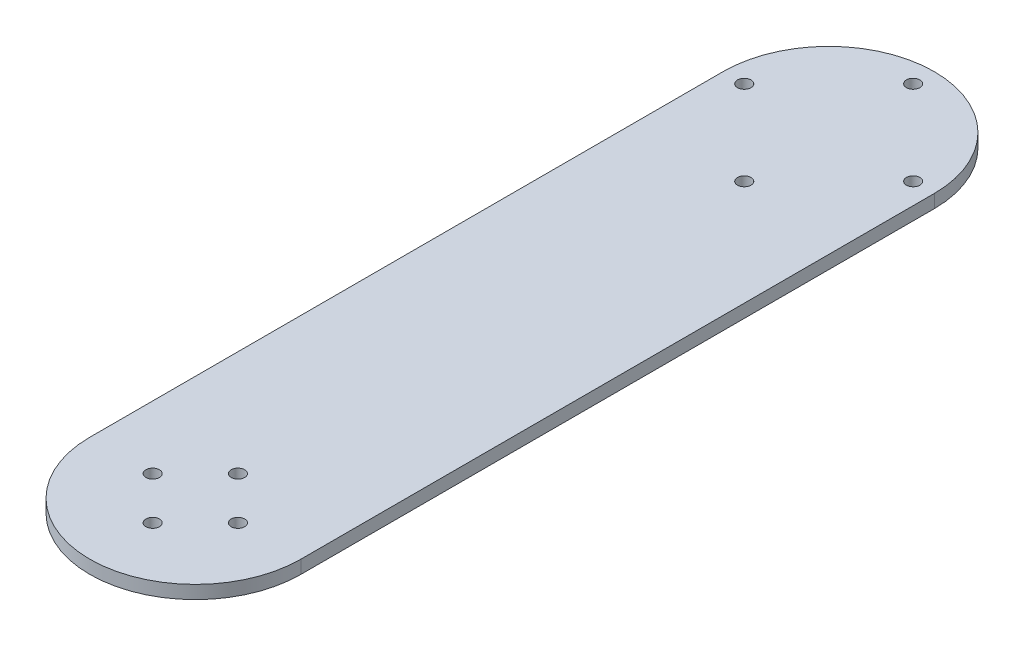
ISO-10303-21;
HEADER;
FILE_DESCRIPTION(('STEP AP214'),'2;1');
FILE_NAME('part.step','',(''),(''),'','','');
FILE_SCHEMA(('AUTOMOTIVE_DESIGN { 1 0 10303 214 1 1 1 1 }'));
ENDSEC;
DATA;
#1=APPLICATION_CONTEXT('core data for automotive mechanical design processes');
#2=APPLICATION_PROTOCOL_DEFINITION('international standard','automotive_design',2000,#1);
#3=PRODUCT_CONTEXT('',#1,'mechanical');
#4=PRODUCT('Part','Part','',(#3));
#5=PRODUCT_RELATED_PRODUCT_CATEGORY('part','',(#4));
#6=PRODUCT_DEFINITION_FORMATION('','',#4);
#7=PRODUCT_DEFINITION_CONTEXT('part definition',#1,'design');
#8=PRODUCT_DEFINITION('design','',#6,#7);
#9=PRODUCT_DEFINITION_SHAPE('','',#8);
#10=(LENGTH_UNIT() NAMED_UNIT(*) SI_UNIT(.MILLI.,.METRE.));
#11=(NAMED_UNIT(*) PLANE_ANGLE_UNIT() SI_UNIT($,.RADIAN.));
#12=(NAMED_UNIT(*) SI_UNIT($,.STERADIAN.) SOLID_ANGLE_UNIT());
#13=UNCERTAINTY_MEASURE_WITH_UNIT(LENGTH_MEASURE(1.E-05),#10,'distance_accuracy_value','');
#14=(GEOMETRIC_REPRESENTATION_CONTEXT(3) GLOBAL_UNCERTAINTY_ASSIGNED_CONTEXT((#13)) GLOBAL_UNIT_ASSIGNED_CONTEXT((#10,
#11,#12)) REPRESENTATION_CONTEXT('',''));
#15=CARTESIAN_POINT('',(0.,0.,0.));
#16=DIRECTION('',(0.,0.,1.));
#17=DIRECTION('',(1.,0.,0.));
#18=AXIS2_PLACEMENT_3D('',#15,#16,#17);
#19=CARTESIAN_POINT('',(0.,-3.125,0.));
#20=DIRECTION('',(0.,1.,0.));
#21=DIRECTION('',(0.,0.,-1.));
#22=AXIS2_PLACEMENT_3D('',#19,#20,#21);
#23=CYLINDRICAL_SURFACE('',#22,25.);
#24=CARTESIAN_POINT('',(0.,0.,0.));
#25=DIRECTION('',(0.,-1.,0.));
#26=DIRECTION('',(0.,0.,-1.));
#27=AXIS2_PLACEMENT_3D('',#24,#25,#26);
#28=CIRCLE('',#27,25.);
#29=CARTESIAN_POINT('',(25.,0.,0.));
#30=VERTEX_POINT('',#29);
#31=CARTESIAN_POINT('',(-25.,0.,0.));
#32=VERTEX_POINT('',#31);
#33=EDGE_CURVE('E109',#30,#32,#28,.T.);
#34=ORIENTED_EDGE('',*,*,#33,.T.);
#35=DIRECTION('',(0.,1.,0.));
#36=VECTOR('',#35,1.);
#37=CARTESIAN_POINT('',(-25.,-3.125,0.));
#38=LINE('',#37,#36);
#39=CARTESIAN_POINT('',(-25.,-3.125,0.));
#40=VERTEX_POINT('',#39);
#41=EDGE_CURVE('E48',#40,#32,#38,.T.);
#42=ORIENTED_EDGE('',*,*,#41,.F.);
#43=CARTESIAN_POINT('',(0.,-3.125,0.));
#44=DIRECTION('',(0.,-1.,0.));
#45=DIRECTION('',(0.,0.,-1.));
#46=AXIS2_PLACEMENT_3D('',#43,#44,#45);
#47=CIRCLE('',#46,25.);
#48=CARTESIAN_POINT('',(25.,-3.125,0.));
#49=VERTEX_POINT('',#48);
#50=EDGE_CURVE('E98',#49,#40,#47,.T.);
#51=ORIENTED_EDGE('',*,*,#50,.F.);
#52=DIRECTION('',(0.,1.,0.));
#53=VECTOR('',#52,1.);
#54=CARTESIAN_POINT('',(25.,-3.125,0.));
#55=LINE('',#54,#53);
#56=EDGE_CURVE('E11',#49,#30,#55,.T.);
#57=ORIENTED_EDGE('',*,*,#56,.T.);
#58=EDGE_LOOP('',(#34,#42,#51,#57));
#59=FACE_BOUND('',#58,.T.);
#60=ADVANCED_FACE('F45',(#59),#23,.T.);
#61=CARTESIAN_POINT('',(25.,-3.125,0.));
#62=DIRECTION('',(1.,0.,0.));
#63=DIRECTION('',(0.,0.,1.));
#64=AXIS2_PLACEMENT_3D('',#61,#62,#63);
#65=PLANE('',#64);
#66=DIRECTION('',(0.,0.,1.));
#67=VECTOR('',#66,1.);
#68=CARTESIAN_POINT('',(25.,0.,0.));
#69=LINE('',#68,#67);
#70=CARTESIAN_POINT('',(25.,0.,-150.));
#71=VERTEX_POINT('',#70);
#72=EDGE_CURVE('E86',#71,#30,#69,.T.);
#73=ORIENTED_EDGE('',*,*,#72,.T.);
#74=ORIENTED_EDGE('',*,*,#56,.F.);
#75=DIRECTION('',(0.,0.,1.));
#76=VECTOR('',#75,1.);
#77=CARTESIAN_POINT('',(25.,-3.125,0.));
#78=LINE('',#77,#76);
#79=CARTESIAN_POINT('',(25.,-3.125,-150.));
#80=VERTEX_POINT('',#79);
#81=EDGE_CURVE('E63',#80,#49,#78,.T.);
#82=ORIENTED_EDGE('',*,*,#81,.F.);
#83=DIRECTION('',(0.,1.,0.));
#84=VECTOR('',#83,1.);
#85=CARTESIAN_POINT('',(25.,-3.125,-150.));
#86=LINE('',#85,#84);
#87=EDGE_CURVE('E54',#80,#71,#86,.T.);
#88=ORIENTED_EDGE('',*,*,#87,.T.);
#89=EDGE_LOOP('',(#73,#74,#82,#88));
#90=FACE_BOUND('',#89,.T.);
#91=ADVANCED_FACE('F116',(#90),#65,.T.);
#92=CARTESIAN_POINT('',(0.,-3.125,-150.));
#93=DIRECTION('',(0.,1.,0.));
#94=DIRECTION('',(0.,0.,-1.));
#95=AXIS2_PLACEMENT_3D('',#92,#93,#94);
#96=CYLINDRICAL_SURFACE('',#95,25.);
#97=CARTESIAN_POINT('',(0.,0.,-150.));
#98=DIRECTION('',(0.,-1.,0.));
#99=DIRECTION('',(0.,0.,-1.));
#100=AXIS2_PLACEMENT_3D('',#97,#98,#99);
#101=CIRCLE('',#100,25.);
#102=CARTESIAN_POINT('',(-25.,0.,-150.));
#103=VERTEX_POINT('',#102);
#104=EDGE_CURVE('E80',#103,#71,#101,.T.);
#105=ORIENTED_EDGE('',*,*,#104,.T.);
#106=ORIENTED_EDGE('',*,*,#87,.F.);
#107=CARTESIAN_POINT('',(0.,-3.125,-150.));
#108=DIRECTION('',(0.,-1.,0.));
#109=DIRECTION('',(0.,0.,-1.));
#110=AXIS2_PLACEMENT_3D('',#107,#108,#109);
#111=CIRCLE('',#110,25.);
#112=CARTESIAN_POINT('',(-25.,-3.125,-150.));
#113=VERTEX_POINT('',#112);
#114=EDGE_CURVE('E96',#113,#80,#111,.T.);
#115=ORIENTED_EDGE('',*,*,#114,.F.);
#116=DIRECTION('',(0.,1.,0.));
#117=VECTOR('',#116,1.);
#118=CARTESIAN_POINT('',(-25.,-3.125,-150.));
#119=LINE('',#118,#117);
#120=EDGE_CURVE('E101',#113,#103,#119,.T.);
#121=ORIENTED_EDGE('',*,*,#120,.T.);
#122=EDGE_LOOP('',(#105,#106,#115,#121));
#123=FACE_BOUND('',#122,.T.);
#124=ADVANCED_FACE('F104',(#123),#96,.T.);
#125=CARTESIAN_POINT('',(-25.,-3.125,0.));
#126=DIRECTION('',(-1.,0.,0.));
#127=DIRECTION('',(0.,0.,-1.));
#128=AXIS2_PLACEMENT_3D('',#125,#126,#127);
#129=PLANE('',#128);
#130=DIRECTION('',(0.,0.,-1.));
#131=VECTOR('',#130,1.);
#132=CARTESIAN_POINT('',(-25.,0.,0.));
#133=LINE('',#132,#131);
#134=EDGE_CURVE('E103',#32,#103,#133,.T.);
#135=ORIENTED_EDGE('',*,*,#134,.T.);
#136=ORIENTED_EDGE('',*,*,#120,.F.);
#137=DIRECTION('',(0.,0.,-1.));
#138=VECTOR('',#137,1.);
#139=CARTESIAN_POINT('',(-25.,-3.125,0.));
#140=LINE('',#139,#138);
#141=EDGE_CURVE('E93',#40,#113,#140,.T.);
#142=ORIENTED_EDGE('',*,*,#141,.F.);
#143=ORIENTED_EDGE('',*,*,#41,.T.);
#144=EDGE_LOOP('',(#135,#136,#142,#143));
#145=FACE_BOUND('',#144,.T.);
#146=ADVANCED_FACE('F102',(#145),#129,.T.);
#147=CARTESIAN_POINT('',(0.,-3.125,0.));
#148=DIRECTION('',(0.,1.,0.));
#149=DIRECTION('',(0.,0.,-1.));
#150=AXIS2_PLACEMENT_3D('',#147,#148,#149);
#151=PLANE('',#150);
#152=CARTESIAN_POINT('',(0.,-3.125,-130.));
#153=DIRECTION('',(0.,-1.,0.));
#154=DIRECTION('',(0.,0.,-1.));
#155=AXIS2_PLACEMENT_3D('',#152,#153,#154);
#156=CIRCLE('',#155,1.59999999999999);
#157=CARTESIAN_POINT('',(0.,-3.125,-131.6));
#158=VERTEX_POINT('',#157);
#159=EDGE_CURVE('E126',#158,#158,#156,.T.);
#160=ORIENTED_EDGE('',*,*,#159,.F.);
#161=EDGE_LOOP('',(#160));
#162=FACE_BOUND('',#161,.T.);
#163=CARTESIAN_POINT('',(-20.,-3.125,-150.));
#164=DIRECTION('',(0.,-1.,0.));
#165=DIRECTION('',(0.,0.,-1.));
#166=AXIS2_PLACEMENT_3D('',#163,#164,#165);
#167=CIRCLE('',#166,1.59999999999999);
#168=CARTESIAN_POINT('',(-20.,-3.125,-151.6));
#169=VERTEX_POINT('',#168);
#170=EDGE_CURVE('E158',#169,#169,#167,.T.);
#171=ORIENTED_EDGE('',*,*,#170,.F.);
#172=EDGE_LOOP('',(#171));
#173=FACE_BOUND('',#172,.T.);
#174=CARTESIAN_POINT('',(0.,-3.125,-170.));
#175=DIRECTION('',(0.,-1.,0.));
#176=DIRECTION('',(0.,0.,-1.));
#177=AXIS2_PLACEMENT_3D('',#174,#175,#176);
#178=CIRCLE('',#177,1.59999999999999);
#179=CARTESIAN_POINT('',(0.,-3.125,-171.6));
#180=VERTEX_POINT('',#179);
#181=EDGE_CURVE('E152',#180,#180,#178,.T.);
#182=ORIENTED_EDGE('',*,*,#181,.F.);
#183=EDGE_LOOP('',(#182));
#184=FACE_BOUND('',#183,.T.);
#185=CARTESIAN_POINT('',(20.,-3.125,-150.));
#186=DIRECTION('',(0.,-1.,0.));
#187=DIRECTION('',(0.,0.,-1.));
#188=AXIS2_PLACEMENT_3D('',#185,#186,#187);
#189=CIRCLE('',#188,1.59999999999999);
#190=CARTESIAN_POINT('',(20.,-3.125,-151.6));
#191=VERTEX_POINT('',#190);
#192=EDGE_CURVE('E146',#191,#191,#189,.T.);
#193=ORIENTED_EDGE('',*,*,#192,.F.);
#194=EDGE_LOOP('',(#193));
#195=FACE_BOUND('',#194,.T.);
#196=CARTESIAN_POINT('',(0.,-3.125,10.0985931710275));
#197=DIRECTION('',(0.,1.,0.));
#198=DIRECTION('',(0.,0.,1.));
#199=AXIS2_PLACEMENT_3D('',#196,#197,#198);
#200=CIRCLE('',#199,1.6);
#201=CARTESIAN_POINT('',(0.,-3.125,11.6985931710275));
#202=VERTEX_POINT('',#201);
#203=EDGE_CURVE('E141',#202,#202,#200,.T.);
#204=ORIENTED_EDGE('',*,*,#203,.T.);
#205=EDGE_LOOP('',(#204));
#206=FACE_BOUND('',#205,.T.);
#207=CARTESIAN_POINT('',(10.0985931710275,-3.125,0.));
#208=DIRECTION('',(0.,1.,0.));
#209=DIRECTION('',(0.,0.,1.));
#210=AXIS2_PLACEMENT_3D('',#207,#208,#209);
#211=CIRCLE('',#210,1.6);
#212=CARTESIAN_POINT('',(10.0985931710275,-3.125,1.60000000000002));
#213=VERTEX_POINT('',#212);
#214=EDGE_CURVE('E138',#213,#213,#211,.T.);
#215=ORIENTED_EDGE('',*,*,#214,.T.);
#216=EDGE_LOOP('',(#215));
#217=FACE_BOUND('',#216,.T.);
#218=CARTESIAN_POINT('',(-10.0985931710274,-3.125,0.));
#219=DIRECTION('',(0.,1.,0.));
#220=DIRECTION('',(0.,0.,1.));
#221=AXIS2_PLACEMENT_3D('',#218,#219,#220);
#222=CIRCLE('',#221,1.6);
#223=CARTESIAN_POINT('',(-10.0985931710274,-3.125,1.60000000000002));
#224=VERTEX_POINT('',#223);
#225=EDGE_CURVE('E132',#224,#224,#222,.T.);
#226=ORIENTED_EDGE('',*,*,#225,.T.);
#227=EDGE_LOOP('',(#226));
#228=FACE_BOUND('',#227,.T.);
#229=CARTESIAN_POINT('',(0.,-3.125,-10.0985931710274));
#230=DIRECTION('',(0.,1.,0.));
#231=DIRECTION('',(0.,0.,1.));
#232=AXIS2_PLACEMENT_3D('',#229,#230,#231);
#233=CIRCLE('',#232,1.6);
#234=CARTESIAN_POINT('',(0.,-3.125,-8.49859317102743));
#235=VERTEX_POINT('',#234);
#236=EDGE_CURVE('E125',#235,#235,#233,.T.);
#237=ORIENTED_EDGE('',*,*,#236,.T.);
#238=EDGE_LOOP('',(#237));
#239=FACE_BOUND('',#238,.T.);
#240=ORIENTED_EDGE('',*,*,#50,.T.);
#241=ORIENTED_EDGE('',*,*,#141,.T.);
#242=ORIENTED_EDGE('',*,*,#114,.T.);
#243=ORIENTED_EDGE('',*,*,#81,.T.);
#244=EDGE_LOOP('',(#240,#241,#242,#243));
#245=FACE_BOUND('',#244,.T.);
#246=ADVANCED_FACE('F94',(#162,#173,#184,#195,#206,#217,#228,#239,#245),#151,.F.);
#247=CARTESIAN_POINT('',(0.,0.,0.));
#248=DIRECTION('',(0.,1.,0.));
#249=DIRECTION('',(0.,0.,-1.));
#250=AXIS2_PLACEMENT_3D('',#247,#248,#249);
#251=PLANE('',#250);
#252=CARTESIAN_POINT('',(0.,0.,-130.));
#253=DIRECTION('',(0.,-1.,0.));
#254=DIRECTION('',(0.,0.,-1.));
#255=AXIS2_PLACEMENT_3D('',#252,#253,#254);
#256=CIRCLE('',#255,1.59999999999999);
#257=CARTESIAN_POINT('',(0.,0.,-131.6));
#258=VERTEX_POINT('',#257);
#259=EDGE_CURVE('E164',#258,#258,#256,.T.);
#260=ORIENTED_EDGE('',*,*,#259,.T.);
#261=EDGE_LOOP('',(#260));
#262=FACE_BOUND('',#261,.T.);
#263=CARTESIAN_POINT('',(-20.,0.,-150.));
#264=DIRECTION('',(0.,-1.,0.));
#265=DIRECTION('',(0.,0.,-1.));
#266=AXIS2_PLACEMENT_3D('',#263,#264,#265);
#267=CIRCLE('',#266,1.59999999999999);
#268=CARTESIAN_POINT('',(-20.,0.,-151.6));
#269=VERTEX_POINT('',#268);
#270=EDGE_CURVE('E161',#269,#269,#267,.T.);
#271=ORIENTED_EDGE('',*,*,#270,.T.);
#272=EDGE_LOOP('',(#271));
#273=FACE_BOUND('',#272,.T.);
#274=CARTESIAN_POINT('',(0.,0.,-170.));
#275=DIRECTION('',(0.,-1.,0.));
#276=DIRECTION('',(0.,0.,-1.));
#277=AXIS2_PLACEMENT_3D('',#274,#275,#276);
#278=CIRCLE('',#277,1.59999999999999);
#279=CARTESIAN_POINT('',(0.,0.,-171.6));
#280=VERTEX_POINT('',#279);
#281=EDGE_CURVE('E155',#280,#280,#278,.T.);
#282=ORIENTED_EDGE('',*,*,#281,.T.);
#283=EDGE_LOOP('',(#282));
#284=FACE_BOUND('',#283,.T.);
#285=CARTESIAN_POINT('',(20.,0.,-150.));
#286=DIRECTION('',(0.,-1.,0.));
#287=DIRECTION('',(0.,0.,-1.));
#288=AXIS2_PLACEMENT_3D('',#285,#286,#287);
#289=CIRCLE('',#288,1.59999999999999);
#290=CARTESIAN_POINT('',(20.,0.,-151.6));
#291=VERTEX_POINT('',#290);
#292=EDGE_CURVE('E149',#291,#291,#289,.T.);
#293=ORIENTED_EDGE('',*,*,#292,.T.);
#294=EDGE_LOOP('',(#293));
#295=FACE_BOUND('',#294,.T.);
#296=CARTESIAN_POINT('',(0.,0.,10.0985931710275));
#297=DIRECTION('',(0.,1.,0.));
#298=DIRECTION('',(0.,0.,1.));
#299=AXIS2_PLACEMENT_3D('',#296,#297,#298);
#300=CIRCLE('',#299,1.6);
#301=CARTESIAN_POINT('',(0.,0.,11.6985931710275));
#302=VERTEX_POINT('',#301);
#303=EDGE_CURVE('E112',#302,#302,#300,.T.);
#304=ORIENTED_EDGE('',*,*,#303,.F.);
#305=EDGE_LOOP('',(#304));
#306=FACE_BOUND('',#305,.T.);
#307=CARTESIAN_POINT('',(10.0985931710275,0.,0.));
#308=DIRECTION('',(0.,1.,0.));
#309=DIRECTION('',(0.,0.,1.));
#310=AXIS2_PLACEMENT_3D('',#307,#308,#309);
#311=CIRCLE('',#310,1.6);
#312=CARTESIAN_POINT('',(10.0985931710275,0.,1.60000000000002));
#313=VERTEX_POINT('',#312);
#314=EDGE_CURVE('E135',#313,#313,#311,.T.);
#315=ORIENTED_EDGE('',*,*,#314,.F.);
#316=EDGE_LOOP('',(#315));
#317=FACE_BOUND('',#316,.T.);
#318=CARTESIAN_POINT('',(-10.0985931710274,0.,0.));
#319=DIRECTION('',(0.,1.,0.));
#320=DIRECTION('',(0.,0.,1.));
#321=AXIS2_PLACEMENT_3D('',#318,#319,#320);
#322=CIRCLE('',#321,1.6);
#323=CARTESIAN_POINT('',(-10.0985931710274,0.,1.60000000000002));
#324=VERTEX_POINT('',#323);
#325=EDGE_CURVE('E129',#324,#324,#322,.T.);
#326=ORIENTED_EDGE('',*,*,#325,.F.);
#327=EDGE_LOOP('',(#326));
#328=FACE_BOUND('',#327,.T.);
#329=CARTESIAN_POINT('',(0.,0.,-10.0985931710274));
#330=DIRECTION('',(0.,1.,0.));
#331=DIRECTION('',(0.,0.,1.));
#332=AXIS2_PLACEMENT_3D('',#329,#330,#331);
#333=CIRCLE('',#332,1.6);
#334=CARTESIAN_POINT('',(0.,0.,-8.49859317102743));
#335=VERTEX_POINT('',#334);
#336=EDGE_CURVE('E122',#335,#335,#333,.T.);
#337=ORIENTED_EDGE('',*,*,#336,.F.);
#338=EDGE_LOOP('',(#337));
#339=FACE_BOUND('',#338,.T.);
#340=ORIENTED_EDGE('',*,*,#33,.F.);
#341=ORIENTED_EDGE('',*,*,#72,.F.);
#342=ORIENTED_EDGE('',*,*,#104,.F.);
#343=ORIENTED_EDGE('',*,*,#134,.F.);
#344=EDGE_LOOP('',(#340,#341,#342,#343));
#345=FACE_BOUND('',#344,.T.);
#346=ADVANCED_FACE('F119',(#262,#273,#284,#295,#306,#317,#328,#339,#345),#251,.T.);
#347=CARTESIAN_POINT('',(0.,0.,-10.0985931710274));
#348=DIRECTION('',(0.,-1.,0.));
#349=DIRECTION('',(0.,0.,1.));
#350=AXIS2_PLACEMENT_3D('',#347,#348,#349);
#351=CYLINDRICAL_SURFACE('',#350,1.6);
#352=ORIENTED_EDGE('',*,*,#336,.T.);
#353=EDGE_LOOP('',(#352));
#354=FACE_BOUND('',#353,.T.);
#355=ORIENTED_EDGE('',*,*,#236,.F.);
#356=EDGE_LOOP('',(#355));
#357=FACE_BOUND('',#356,.T.);
#358=ADVANCED_FACE('F190',(#354,#357),#351,.F.);
#359=CARTESIAN_POINT('',(-10.0985931710274,0.,0.));
#360=DIRECTION('',(0.,-1.,0.));
#361=DIRECTION('',(0.,0.,1.));
#362=AXIS2_PLACEMENT_3D('',#359,#360,#361);
#363=CYLINDRICAL_SURFACE('',#362,1.6);
#364=ORIENTED_EDGE('',*,*,#325,.T.);
#365=EDGE_LOOP('',(#364));
#366=FACE_BOUND('',#365,.T.);
#367=ORIENTED_EDGE('',*,*,#225,.F.);
#368=EDGE_LOOP('',(#367));
#369=FACE_BOUND('',#368,.T.);
#370=ADVANCED_FACE('F192',(#366,#369),#363,.F.);
#371=CARTESIAN_POINT('',(10.0985931710275,0.,0.));
#372=DIRECTION('',(0.,-1.,0.));
#373=DIRECTION('',(0.,0.,1.));
#374=AXIS2_PLACEMENT_3D('',#371,#372,#373);
#375=CYLINDRICAL_SURFACE('',#374,1.6);
#376=ORIENTED_EDGE('',*,*,#314,.T.);
#377=EDGE_LOOP('',(#376));
#378=FACE_BOUND('',#377,.T.);
#379=ORIENTED_EDGE('',*,*,#214,.F.);
#380=EDGE_LOOP('',(#379));
#381=FACE_BOUND('',#380,.T.);
#382=ADVANCED_FACE('F198',(#378,#381),#375,.F.);
#383=CARTESIAN_POINT('',(0.,0.,10.0985931710275));
#384=DIRECTION('',(0.,-1.,0.));
#385=DIRECTION('',(0.,0.,1.));
#386=AXIS2_PLACEMENT_3D('',#383,#384,#385);
#387=CYLINDRICAL_SURFACE('',#386,1.6);
#388=ORIENTED_EDGE('',*,*,#303,.T.);
#389=EDGE_LOOP('',(#388));
#390=FACE_BOUND('',#389,.T.);
#391=ORIENTED_EDGE('',*,*,#203,.F.);
#392=EDGE_LOOP('',(#391));
#393=FACE_BOUND('',#392,.T.);
#394=ADVANCED_FACE('F224',(#390,#393),#387,.F.);
#395=CARTESIAN_POINT('',(20.,-3.125,-150.));
#396=DIRECTION('',(0.,1.,0.));
#397=DIRECTION('',(0.,0.,-1.));
#398=AXIS2_PLACEMENT_3D('',#395,#396,#397);
#399=CYLINDRICAL_SURFACE('',#398,1.59999999999999);
#400=ORIENTED_EDGE('',*,*,#192,.T.);
#401=EDGE_LOOP('',(#400));
#402=FACE_BOUND('',#401,.T.);
#403=ORIENTED_EDGE('',*,*,#292,.F.);
#404=EDGE_LOOP('',(#403));
#405=FACE_BOUND('',#404,.T.);
#406=ADVANCED_FACE('F232',(#402,#405),#399,.F.);
#407=CARTESIAN_POINT('',(0.,-3.125,-170.));
#408=DIRECTION('',(0.,1.,0.));
#409=DIRECTION('',(0.,0.,-1.));
#410=AXIS2_PLACEMENT_3D('',#407,#408,#409);
#411=CYLINDRICAL_SURFACE('',#410,1.59999999999999);
#412=ORIENTED_EDGE('',*,*,#181,.T.);
#413=EDGE_LOOP('',(#412));
#414=FACE_BOUND('',#413,.T.);
#415=ORIENTED_EDGE('',*,*,#281,.F.);
#416=EDGE_LOOP('',(#415));
#417=FACE_BOUND('',#416,.T.);
#418=ADVANCED_FACE('F240',(#414,#417),#411,.F.);
#419=CARTESIAN_POINT('',(-20.,-3.125,-150.));
#420=DIRECTION('',(0.,1.,0.));
#421=DIRECTION('',(0.,0.,-1.));
#422=AXIS2_PLACEMENT_3D('',#419,#420,#421);
#423=CYLINDRICAL_SURFACE('',#422,1.59999999999999);
#424=ORIENTED_EDGE('',*,*,#170,.T.);
#425=EDGE_LOOP('',(#424));
#426=FACE_BOUND('',#425,.T.);
#427=ORIENTED_EDGE('',*,*,#270,.F.);
#428=EDGE_LOOP('',(#427));
#429=FACE_BOUND('',#428,.T.);
#430=ADVANCED_FACE('F248',(#426,#429),#423,.F.);
#431=CARTESIAN_POINT('',(0.,-3.125,-130.));
#432=DIRECTION('',(0.,1.,0.));
#433=DIRECTION('',(0.,0.,-1.));
#434=AXIS2_PLACEMENT_3D('',#431,#432,#433);
#435=CYLINDRICAL_SURFACE('',#434,1.59999999999999);
#436=ORIENTED_EDGE('',*,*,#159,.T.);
#437=EDGE_LOOP('',(#436));
#438=FACE_BOUND('',#437,.T.);
#439=ORIENTED_EDGE('',*,*,#259,.F.);
#440=EDGE_LOOP('',(#439));
#441=FACE_BOUND('',#440,.T.);
#442=ADVANCED_FACE('F170',(#438,#441),#435,.F.);
#443=CLOSED_SHELL('',(#60,#91,#124,#146,#246,#346,#358,#370,#382,#394,#406,#418,#430,#442));
#444=MANIFOLD_SOLID_BREP('B2',#443);
#445=ADVANCED_BREP_SHAPE_REPRESENTATION('',(#18,#444),#14);
#446=SHAPE_DEFINITION_REPRESENTATION(#9,#445);
ENDSEC;
END-ISO-10303-21;
